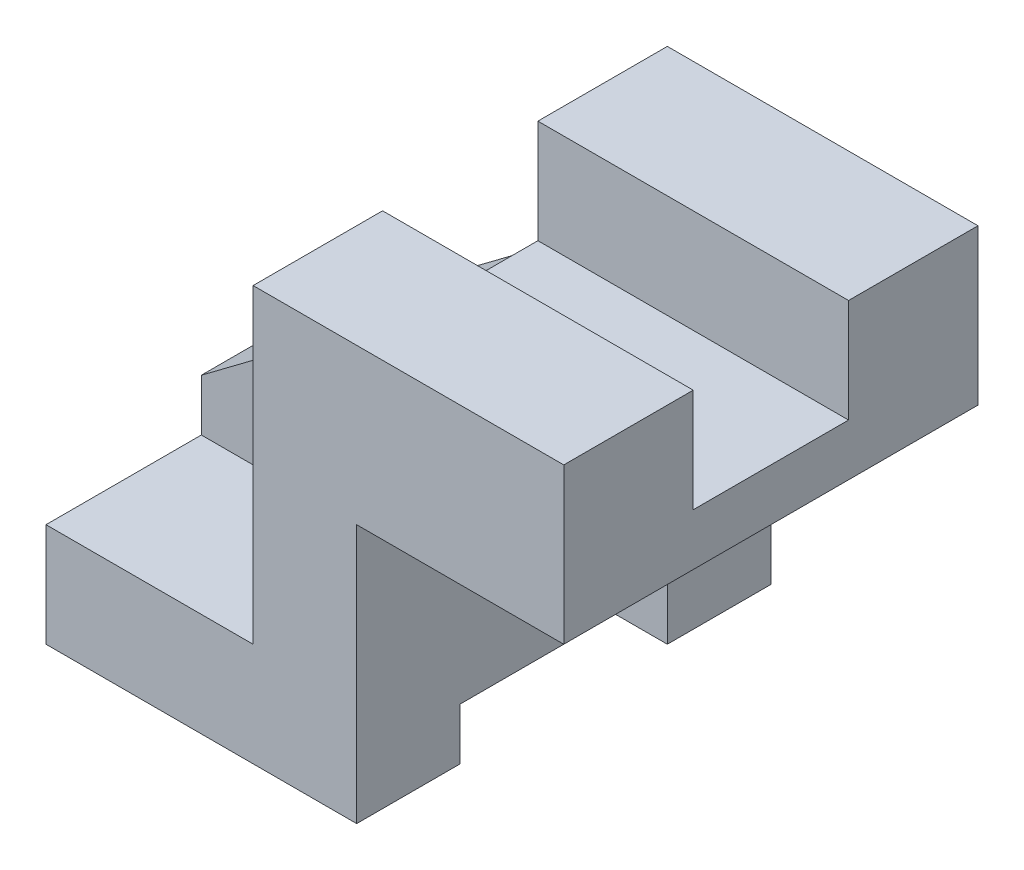
ISO-10303-21;
HEADER;
FILE_DESCRIPTION(('STEP AP214'),'2;1');
FILE_NAME('part.step','',(''),(''),'','','');
FILE_SCHEMA(('AUTOMOTIVE_DESIGN { 1 0 10303 214 1 1 1 1 }'));
ENDSEC;
DATA;
#1=APPLICATION_CONTEXT('core data for automotive mechanical design processes');
#2=APPLICATION_PROTOCOL_DEFINITION('international standard','automotive_design',2000,#1);
#3=PRODUCT_CONTEXT('',#1,'mechanical');
#4=PRODUCT('Part','Part','',(#3));
#5=PRODUCT_RELATED_PRODUCT_CATEGORY('part','',(#4));
#6=PRODUCT_DEFINITION_FORMATION('','',#4);
#7=PRODUCT_DEFINITION_CONTEXT('part definition',#1,'design');
#8=PRODUCT_DEFINITION('design','',#6,#7);
#9=PRODUCT_DEFINITION_SHAPE('','',#8);
#10=(LENGTH_UNIT() NAMED_UNIT(*) SI_UNIT(.MILLI.,.METRE.));
#11=(NAMED_UNIT(*) PLANE_ANGLE_UNIT() SI_UNIT($,.RADIAN.));
#12=(NAMED_UNIT(*) SI_UNIT($,.STERADIAN.) SOLID_ANGLE_UNIT());
#13=UNCERTAINTY_MEASURE_WITH_UNIT(LENGTH_MEASURE(1.E-05),#10,'distance_accuracy_value','');
#14=(GEOMETRIC_REPRESENTATION_CONTEXT(3) GLOBAL_UNCERTAINTY_ASSIGNED_CONTEXT((#13)) GLOBAL_UNIT_ASSIGNED_CONTEXT((#10,
#11,#12)) REPRESENTATION_CONTEXT('',''));
#15=CARTESIAN_POINT('',(0.,0.,0.));
#16=DIRECTION('',(0.,0.,1.));
#17=DIRECTION('',(1.,0.,0.));
#18=AXIS2_PLACEMENT_3D('',#15,#16,#17);
#19=CARTESIAN_POINT('',(0.,0.,40.));
#20=DIRECTION('',(1.,0.,0.));
#21=DIRECTION('',(0.,0.,-1.));
#22=AXIS2_PLACEMENT_3D('',#19,#20,#21);
#23=PLANE('',#22);
#24=DIRECTION('',(0.,-1.,0.));
#25=VECTOR('',#24,1.);
#26=CARTESIAN_POINT('',(0.,0.,20.));
#27=LINE('',#26,#25);
#28=CARTESIAN_POINT('',(0.,9.99999999999999,20.));
#29=VERTEX_POINT('',#28);
#30=CARTESIAN_POINT('',(0.,0.,20.));
#31=VERTEX_POINT('',#30);
#32=EDGE_CURVE('E174',#29,#31,#27,.T.);
#33=ORIENTED_EDGE('',*,*,#32,.T.);
#34=DIRECTION('',(0.,0.,-1.));
#35=VECTOR('',#34,1.);
#36=CARTESIAN_POINT('',(0.,0.,40.));
#37=LINE('',#36,#35);
#38=CARTESIAN_POINT('',(0.,0.,40.));
#39=VERTEX_POINT('',#38);
#40=EDGE_CURVE('E186',#39,#31,#37,.T.);
#41=ORIENTED_EDGE('',*,*,#40,.F.);
#42=DIRECTION('',(0.,-1.,0.));
#43=VECTOR('',#42,1.);
#44=CARTESIAN_POINT('',(0.,0.,40.));
#45=LINE('',#44,#43);
#46=CARTESIAN_POINT('',(0.,20.,40.));
#47=VERTEX_POINT('',#46);
#48=EDGE_CURVE('E274',#47,#39,#45,.T.);
#49=ORIENTED_EDGE('',*,*,#48,.F.);
#50=DIRECTION('',(0.,0.,-1.));
#51=VECTOR('',#50,1.);
#52=CARTESIAN_POINT('',(0.,20.,40.));
#53=LINE('',#52,#51);
#54=CARTESIAN_POINT('',(0.,20.,10.));
#55=VERTEX_POINT('',#54);
#56=EDGE_CURVE('E197',#47,#55,#53,.T.);
#57=ORIENTED_EDGE('',*,*,#56,.T.);
#58=DIRECTION('',(0.,1.,0.));
#59=VECTOR('',#58,1.);
#60=CARTESIAN_POINT('',(0.,0.,10.));
#61=LINE('',#60,#59);
#62=CARTESIAN_POINT('',(0.,30.,10.));
#63=VERTEX_POINT('',#62);
#64=EDGE_CURVE('E246',#55,#63,#61,.T.);
#65=ORIENTED_EDGE('',*,*,#64,.T.);
#66=DIRECTION('',(0.,0.,-1.));
#67=VECTOR('',#66,1.);
#68=CARTESIAN_POINT('',(0.,30.,10.));
#69=LINE('',#68,#67);
#70=CARTESIAN_POINT('',(0.,30.,-10.));
#71=VERTEX_POINT('',#70);
#72=EDGE_CURVE('E268',#63,#71,#69,.T.);
#73=ORIENTED_EDGE('',*,*,#72,.T.);
#74=DIRECTION('',(0.,1.,0.));
#75=VECTOR('',#74,1.);
#76=CARTESIAN_POINT('',(0.,0.,-10.));
#77=LINE('',#76,#75);
#78=CARTESIAN_POINT('',(0.,20.,-10.));
#79=VERTEX_POINT('',#78);
#80=EDGE_CURVE('E258',#79,#71,#77,.T.);
#81=ORIENTED_EDGE('',*,*,#80,.F.);
#82=CARTESIAN_POINT('',(0.,20.,-40.));
#83=VERTEX_POINT('',#82);
#84=EDGE_CURVE('E56',#79,#83,#53,.T.);
#85=ORIENTED_EDGE('',*,*,#84,.T.);
#86=DIRECTION('',(0.,-1.,0.));
#87=VECTOR('',#86,1.);
#88=CARTESIAN_POINT('',(0.,0.,-40.));
#89=LINE('',#88,#87);
#90=CARTESIAN_POINT('',(0.,0.,-40.));
#91=VERTEX_POINT('',#90);
#92=EDGE_CURVE('E290',#83,#91,#89,.T.);
#93=ORIENTED_EDGE('',*,*,#92,.T.);
#94=CARTESIAN_POINT('',(0.,0.,-20.));
#95=VERTEX_POINT('',#94);
#96=EDGE_CURVE('E195',#95,#91,#37,.T.);
#97=ORIENTED_EDGE('',*,*,#96,.F.);
#98=DIRECTION('',(0.,1.,0.));
#99=VECTOR('',#98,1.);
#100=CARTESIAN_POINT('',(0.,10.,-20.));
#101=LINE('',#100,#99);
#102=CARTESIAN_POINT('',(0.,10.,-20.));
#103=VERTEX_POINT('',#102);
#104=EDGE_CURVE('E190',#95,#103,#101,.T.);
#105=ORIENTED_EDGE('',*,*,#104,.T.);
#106=DIRECTION('',(0.,0.,1.));
#107=VECTOR('',#106,1.);
#108=CARTESIAN_POINT('',(0.,9.99999999999999,20.));
#109=LINE('',#108,#107);
#110=EDGE_CURVE('E189',#103,#29,#109,.T.);
#111=ORIENTED_EDGE('',*,*,#110,.T.);
#112=EDGE_LOOP('',(#33,#41,#49,#57,#65,#73,#81,#85,#93,#97,#105,#111));
#113=FACE_BOUND('',#112,.T.);
#114=ADVANCED_FACE('F33',(#113),#23,.F.);
#115=CARTESIAN_POINT('',(0.,0.,40.));
#116=DIRECTION('',(0.,1.,0.));
#117=DIRECTION('',(0.,0.,1.));
#118=AXIS2_PLACEMENT_3D('',#115,#116,#117);
#119=PLANE('',#118);
#120=DIRECTION('',(-1.,0.,0.));
#121=VECTOR('',#120,1.);
#122=CARTESIAN_POINT('',(100.,0.,20.));
#123=LINE('',#122,#121);
#124=CARTESIAN_POINT('',(60.,0.,20.));
#125=VERTEX_POINT('',#124);
#126=EDGE_CURVE('E170',#125,#31,#123,.T.);
#127=ORIENTED_EDGE('',*,*,#126,.F.);
#128=DIRECTION('',(0.,0.,-1.));
#129=VECTOR('',#128,1.);
#130=CARTESIAN_POINT('',(60.,0.,40.));
#131=LINE('',#130,#129);
#132=CARTESIAN_POINT('',(60.,0.,40.));
#133=VERTEX_POINT('',#132);
#134=EDGE_CURVE('E199',#133,#125,#131,.T.);
#135=ORIENTED_EDGE('',*,*,#134,.F.);
#136=DIRECTION('',(1.,0.,0.));
#137=VECTOR('',#136,1.);
#138=CARTESIAN_POINT('',(0.,0.,40.));
#139=LINE('',#138,#137);
#140=EDGE_CURVE('E194',#39,#133,#139,.T.);
#141=ORIENTED_EDGE('',*,*,#140,.F.);
#142=ORIENTED_EDGE('',*,*,#40,.T.);
#143=EDGE_LOOP('',(#127,#135,#141,#142));
#144=FACE_BOUND('',#143,.T.);
#145=ADVANCED_FACE('F193',(#144),#119,.F.);
#146=DIRECTION('',(-1.,0.,0.));
#147=VECTOR('',#146,1.);
#148=CARTESIAN_POINT('',(100.,0.,-20.));
#149=LINE('',#148,#147);
#150=CARTESIAN_POINT('',(60.,0.,-20.));
#151=VERTEX_POINT('',#150);
#152=EDGE_CURVE('E182',#151,#95,#149,.T.);
#153=ORIENTED_EDGE('',*,*,#152,.T.);
#154=ORIENTED_EDGE('',*,*,#96,.T.);
#155=DIRECTION('',(1.,0.,0.));
#156=VECTOR('',#155,1.);
#157=CARTESIAN_POINT('',(0.,0.,-40.));
#158=LINE('',#157,#156);
#159=CARTESIAN_POINT('',(60.,0.,-40.));
#160=VERTEX_POINT('',#159);
#161=EDGE_CURVE('E293',#91,#160,#158,.T.);
#162=ORIENTED_EDGE('',*,*,#161,.T.);
#163=EDGE_CURVE('E323',#151,#160,#131,.T.);
#164=ORIENTED_EDGE('',*,*,#163,.F.);
#165=EDGE_LOOP('',(#153,#154,#162,#164));
#166=FACE_BOUND('',#165,.T.);
#167=ADVANCED_FACE('F363',(#166),#119,.F.);
#168=CARTESIAN_POINT('',(60.,0.,40.));
#169=DIRECTION('',(-1.,0.,0.));
#170=DIRECTION('',(0.,-1.,0.));
#171=AXIS2_PLACEMENT_3D('',#168,#169,#170);
#172=PLANE('',#171);
#173=DIRECTION('',(0.,-1.,0.));
#174=VECTOR('',#173,1.);
#175=CARTESIAN_POINT('',(60.,0.,20.));
#176=LINE('',#175,#174);
#177=CARTESIAN_POINT('',(60.,9.99999999999999,20.));
#178=VERTEX_POINT('',#177);
#179=EDGE_CURVE('E11',#178,#125,#176,.T.);
#180=ORIENTED_EDGE('',*,*,#179,.F.);
#181=DIRECTION('',(0.,0.,1.));
#182=VECTOR('',#181,1.);
#183=CARTESIAN_POINT('',(60.,9.99999999999999,40.));
#184=LINE('',#183,#182);
#185=CARTESIAN_POINT('',(60.,10.,-20.));
#186=VERTEX_POINT('',#185);
#187=EDGE_CURVE('E208',#186,#178,#184,.T.);
#188=ORIENTED_EDGE('',*,*,#187,.F.);
#189=DIRECTION('',(0.,1.,0.));
#190=VECTOR('',#189,1.);
#191=CARTESIAN_POINT('',(60.,0.,-20.));
#192=LINE('',#191,#190);
#193=EDGE_CURVE('E41',#151,#186,#192,.T.);
#194=ORIENTED_EDGE('',*,*,#193,.F.);
#195=ORIENTED_EDGE('',*,*,#163,.T.);
#196=DIRECTION('',(0.,1.,0.));
#197=VECTOR('',#196,1.);
#198=CARTESIAN_POINT('',(60.,0.,-40.));
#199=LINE('',#198,#197);
#200=CARTESIAN_POINT('',(60.,50.,-40.));
#201=VERTEX_POINT('',#200);
#202=EDGE_CURVE('E296',#160,#201,#199,.T.);
#203=ORIENTED_EDGE('',*,*,#202,.T.);
#204=DIRECTION('',(0.,0.,-1.));
#205=VECTOR('',#204,1.);
#206=CARTESIAN_POINT('',(60.,50.,40.));
#207=LINE('',#206,#205);
#208=CARTESIAN_POINT('',(60.,50.,40.));
#209=VERTEX_POINT('',#208);
#210=EDGE_CURVE('E321',#209,#201,#207,.T.);
#211=ORIENTED_EDGE('',*,*,#210,.F.);
#212=DIRECTION('',(0.,1.,0.));
#213=VECTOR('',#212,1.);
#214=CARTESIAN_POINT('',(60.,0.,40.));
#215=LINE('',#214,#213);
#216=EDGE_CURVE('E278',#133,#209,#215,.T.);
#217=ORIENTED_EDGE('',*,*,#216,.F.);
#218=ORIENTED_EDGE('',*,*,#134,.T.);
#219=EDGE_LOOP('',(#180,#188,#194,#195,#203,#211,#217,#218));
#220=FACE_BOUND('',#219,.T.);
#221=ADVANCED_FACE('F216',(#220),#172,.F.);
#222=CARTESIAN_POINT('',(100.,0.,40.));
#223=DIRECTION('',(-1.,0.,0.));
#224=DIRECTION('',(0.,-1.,0.));
#225=AXIS2_PLACEMENT_3D('',#222,#223,#224);
#226=PLANE('',#225);
#227=DIRECTION('',(0.,-1.,0.));
#228=VECTOR('',#227,1.);
#229=CARTESIAN_POINT('',(100.,60.,15.));
#230=LINE('',#229,#228);
#231=CARTESIAN_POINT('',(100.,80.,15.));
#232=VERTEX_POINT('',#231);
#233=CARTESIAN_POINT('',(100.,60.,15.));
#234=VERTEX_POINT('',#233);
#235=EDGE_CURVE('E225',#232,#234,#230,.T.);
#236=ORIENTED_EDGE('',*,*,#235,.F.);
#237=DIRECTION('',(0.,0.,-1.));
#238=VECTOR('',#237,1.);
#239=CARTESIAN_POINT('',(100.,80.,40.));
#240=LINE('',#239,#238);
#241=CARTESIAN_POINT('',(100.,80.,40.));
#242=VERTEX_POINT('',#241);
#243=EDGE_CURVE('E316',#242,#232,#240,.T.);
#244=ORIENTED_EDGE('',*,*,#243,.F.);
#245=DIRECTION('',(0.,1.,0.));
#246=VECTOR('',#245,1.);
#247=CARTESIAN_POINT('',(100.,0.,40.));
#248=LINE('',#247,#246);
#249=CARTESIAN_POINT('',(100.,50.,40.));
#250=VERTEX_POINT('',#249);
#251=EDGE_CURVE('E282',#250,#242,#248,.T.);
#252=ORIENTED_EDGE('',*,*,#251,.F.);
#253=DIRECTION('',(0.,0.,-1.));
#254=VECTOR('',#253,1.);
#255=CARTESIAN_POINT('',(100.,50.,40.));
#256=LINE('',#255,#254);
#257=CARTESIAN_POINT('',(100.,50.,-40.));
#258=VERTEX_POINT('',#257);
#259=EDGE_CURVE('E319',#250,#258,#256,.T.);
#260=ORIENTED_EDGE('',*,*,#259,.T.);
#261=DIRECTION('',(0.,1.,0.));
#262=VECTOR('',#261,1.);
#263=CARTESIAN_POINT('',(100.,0.,-40.));
#264=LINE('',#263,#262);
#265=CARTESIAN_POINT('',(100.,80.,-40.));
#266=VERTEX_POINT('',#265);
#267=EDGE_CURVE('E300',#258,#266,#264,.T.);
#268=ORIENTED_EDGE('',*,*,#267,.T.);
#269=CARTESIAN_POINT('',(100.,80.,-15.));
#270=VERTEX_POINT('',#269);
#271=EDGE_CURVE('E315',#270,#266,#240,.T.);
#272=ORIENTED_EDGE('',*,*,#271,.F.);
#273=DIRECTION('',(0.,1.,0.));
#274=VECTOR('',#273,1.);
#275=CARTESIAN_POINT('',(100.,80.,-15.));
#276=LINE('',#275,#274);
#277=CARTESIAN_POINT('',(100.,60.,-15.));
#278=VERTEX_POINT('',#277);
#279=EDGE_CURVE('E229',#278,#270,#276,.T.);
#280=ORIENTED_EDGE('',*,*,#279,.F.);
#281=DIRECTION('',(0.,0.,-1.));
#282=VECTOR('',#281,1.);
#283=CARTESIAN_POINT('',(100.,60.,-15.));
#284=LINE('',#283,#282);
#285=EDGE_CURVE('E227',#234,#278,#284,.T.);
#286=ORIENTED_EDGE('',*,*,#285,.F.);
#287=EDGE_LOOP('',(#236,#244,#252,#260,#268,#272,#280,#286));
#288=FACE_BOUND('',#287,.T.);
#289=ADVANCED_FACE('F369',(#288),#226,.F.);
#290=CARTESIAN_POINT('',(0.,80.,40.));
#291=DIRECTION('',(0.,-1.,0.));
#292=DIRECTION('',(0.,0.,-1.));
#293=AXIS2_PLACEMENT_3D('',#290,#291,#292);
#294=PLANE('',#293);
#295=DIRECTION('',(-1.,0.,0.));
#296=VECTOR('',#295,1.);
#297=CARTESIAN_POINT('',(100.,80.,15.));
#298=LINE('',#297,#296);
#299=CARTESIAN_POINT('',(40.,80.,15.));
#300=VERTEX_POINT('',#299);
#301=EDGE_CURVE('E231',#232,#300,#298,.T.);
#302=ORIENTED_EDGE('',*,*,#301,.T.);
#303=DIRECTION('',(0.,0.,-1.));
#304=VECTOR('',#303,1.);
#305=CARTESIAN_POINT('',(40.,80.,40.));
#306=LINE('',#305,#304);
#307=CARTESIAN_POINT('',(40.,80.,40.));
#308=VERTEX_POINT('',#307);
#309=EDGE_CURVE('E312',#308,#300,#306,.T.);
#310=ORIENTED_EDGE('',*,*,#309,.F.);
#311=DIRECTION('',(-1.,0.,0.));
#312=VECTOR('',#311,1.);
#313=CARTESIAN_POINT('',(0.,80.,40.));
#314=LINE('',#313,#312);
#315=EDGE_CURVE('E284',#242,#308,#314,.T.);
#316=ORIENTED_EDGE('',*,*,#315,.F.);
#317=ORIENTED_EDGE('',*,*,#243,.T.);
#318=EDGE_LOOP('',(#302,#310,#316,#317));
#319=FACE_BOUND('',#318,.T.);
#320=ADVANCED_FACE('F377',(#319),#294,.F.);
#321=DIRECTION('',(-1.,0.,0.));
#322=VECTOR('',#321,1.);
#323=CARTESIAN_POINT('',(100.,80.,-15.));
#324=LINE('',#323,#322);
#325=CARTESIAN_POINT('',(40.,80.,-15.));
#326=VERTEX_POINT('',#325);
#327=EDGE_CURVE('E234',#270,#326,#324,.T.);
#328=ORIENTED_EDGE('',*,*,#327,.F.);
#329=ORIENTED_EDGE('',*,*,#271,.T.);
#330=DIRECTION('',(-1.,0.,0.));
#331=VECTOR('',#330,1.);
#332=CARTESIAN_POINT('',(0.,80.,-40.));
#333=LINE('',#332,#331);
#334=CARTESIAN_POINT('',(40.,80.,-40.));
#335=VERTEX_POINT('',#334);
#336=EDGE_CURVE('E303',#266,#335,#333,.T.);
#337=ORIENTED_EDGE('',*,*,#336,.T.);
#338=EDGE_CURVE('E311',#326,#335,#306,.T.);
#339=ORIENTED_EDGE('',*,*,#338,.F.);
#340=EDGE_LOOP('',(#328,#329,#337,#339));
#341=FACE_BOUND('',#340,.T.);
#342=ADVANCED_FACE('F400',(#341),#294,.F.);
#343=CARTESIAN_POINT('',(40.,0.,40.));
#344=DIRECTION('',(1.,0.,0.));
#345=DIRECTION('',(0.,0.,-1.));
#346=AXIS2_PLACEMENT_3D('',#343,#344,#345);
#347=PLANE('',#346);
#348=DIRECTION('',(0.,1.,0.));
#349=VECTOR('',#348,1.);
#350=CARTESIAN_POINT('',(40.,0.,15.));
#351=LINE('',#350,#349);
#352=CARTESIAN_POINT('',(40.,60.,15.));
#353=VERTEX_POINT('',#352);
#354=EDGE_CURVE('E206',#353,#300,#351,.T.);
#355=ORIENTED_EDGE('',*,*,#354,.F.);
#356=DIRECTION('',(0.,0.,1.));
#357=VECTOR('',#356,1.);
#358=CARTESIAN_POINT('',(40.,60.,40.));
#359=LINE('',#358,#357);
#360=CARTESIAN_POINT('',(40.,60.,10.));
#361=VERTEX_POINT('',#360);
#362=EDGE_CURVE('E181',#361,#353,#359,.T.);
#363=ORIENTED_EDGE('',*,*,#362,.F.);
#364=DIRECTION('',(0.,-1.,0.));
#365=VECTOR('',#364,1.);
#366=CARTESIAN_POINT('',(40.,0.,10.));
#367=LINE('',#366,#365);
#368=CARTESIAN_POINT('',(40.,20.,10.));
#369=VERTEX_POINT('',#368);
#370=EDGE_CURVE('E252',#361,#369,#367,.T.);
#371=ORIENTED_EDGE('',*,*,#370,.T.);
#372=DIRECTION('',(0.,0.,-1.));
#373=VECTOR('',#372,1.);
#374=CARTESIAN_POINT('',(40.,20.,40.));
#375=LINE('',#374,#373);
#376=CARTESIAN_POINT('',(40.,20.,40.));
#377=VERTEX_POINT('',#376);
#378=EDGE_CURVE('E308',#377,#369,#375,.T.);
#379=ORIENTED_EDGE('',*,*,#378,.F.);
#380=DIRECTION('',(0.,-1.,0.));
#381=VECTOR('',#380,1.);
#382=CARTESIAN_POINT('',(40.,0.,40.));
#383=LINE('',#382,#381);
#384=EDGE_CURVE('E286',#308,#377,#383,.T.);
#385=ORIENTED_EDGE('',*,*,#384,.F.);
#386=ORIENTED_EDGE('',*,*,#309,.T.);
#387=EDGE_LOOP('',(#355,#363,#371,#379,#385,#386));
#388=FACE_BOUND('',#387,.T.);
#389=ADVANCED_FACE('F380',(#388),#347,.F.);
#390=CARTESIAN_POINT('',(40.,60.,-15.));
#391=VERTEX_POINT('',#390);
#392=CARTESIAN_POINT('',(40.,60.,-10.));
#393=VERTEX_POINT('',#392);
#394=EDGE_CURVE('E242',#391,#393,#359,.T.);
#395=ORIENTED_EDGE('',*,*,#394,.F.);
#396=DIRECTION('',(0.,-1.,0.));
#397=VECTOR('',#396,1.);
#398=CARTESIAN_POINT('',(40.,0.,-15.));
#399=LINE('',#398,#397);
#400=EDGE_CURVE('E204',#326,#391,#399,.T.);
#401=ORIENTED_EDGE('',*,*,#400,.F.);
#402=ORIENTED_EDGE('',*,*,#338,.T.);
#403=DIRECTION('',(0.,-1.,0.));
#404=VECTOR('',#403,1.);
#405=CARTESIAN_POINT('',(40.,0.,-40.));
#406=LINE('',#405,#404);
#407=CARTESIAN_POINT('',(40.,20.,-40.));
#408=VERTEX_POINT('',#407);
#409=EDGE_CURVE('E275',#335,#408,#406,.T.);
#410=ORIENTED_EDGE('',*,*,#409,.T.);
#411=CARTESIAN_POINT('',(40.,20.,-10.));
#412=VERTEX_POINT('',#411);
#413=EDGE_CURVE('E288',#412,#408,#375,.T.);
#414=ORIENTED_EDGE('',*,*,#413,.F.);
#415=DIRECTION('',(0.,-1.,0.));
#416=VECTOR('',#415,1.);
#417=CARTESIAN_POINT('',(40.,0.,-10.));
#418=LINE('',#417,#416);
#419=EDGE_CURVE('E247',#393,#412,#418,.T.);
#420=ORIENTED_EDGE('',*,*,#419,.F.);
#421=EDGE_LOOP('',(#395,#401,#402,#410,#414,#420));
#422=FACE_BOUND('',#421,.T.);
#423=ADVANCED_FACE('F353',(#422),#347,.F.);
#424=CARTESIAN_POINT('',(0.,20.,40.));
#425=DIRECTION('',(0.,-1.,0.));
#426=DIRECTION('',(1.,0.,0.));
#427=AXIS2_PLACEMENT_3D('',#424,#425,#426);
#428=PLANE('',#427);
#429=DIRECTION('',(-1.,0.,0.));
#430=VECTOR('',#429,1.);
#431=CARTESIAN_POINT('',(0.,20.,-10.));
#432=LINE('',#431,#430);
#433=EDGE_CURVE('E261',#412,#79,#432,.T.);
#434=ORIENTED_EDGE('',*,*,#433,.F.);
#435=ORIENTED_EDGE('',*,*,#413,.T.);
#436=DIRECTION('',(-1.,0.,0.));
#437=VECTOR('',#436,1.);
#438=CARTESIAN_POINT('',(0.,20.,-40.));
#439=LINE('',#438,#437);
#440=EDGE_CURVE('E270',#408,#83,#439,.T.);
#441=ORIENTED_EDGE('',*,*,#440,.T.);
#442=ORIENTED_EDGE('',*,*,#84,.F.);
#443=EDGE_LOOP('',(#434,#435,#441,#442));
#444=FACE_BOUND('',#443,.T.);
#445=ADVANCED_FACE('F348',(#444),#428,.F.);
#446=ORIENTED_EDGE('',*,*,#378,.T.);
#447=DIRECTION('',(-1.,0.,0.));
#448=VECTOR('',#447,1.);
#449=CARTESIAN_POINT('',(0.,20.,10.));
#450=LINE('',#449,#448);
#451=EDGE_CURVE('E250',#369,#55,#450,.T.);
#452=ORIENTED_EDGE('',*,*,#451,.T.);
#453=ORIENTED_EDGE('',*,*,#56,.F.);
#454=DIRECTION('',(-1.,0.,0.));
#455=VECTOR('',#454,1.);
#456=CARTESIAN_POINT('',(0.,20.,40.));
#457=LINE('',#456,#455);
#458=EDGE_CURVE('E271',#377,#47,#457,.T.);
#459=ORIENTED_EDGE('',*,*,#458,.F.);
#460=EDGE_LOOP('',(#446,#452,#453,#459));
#461=FACE_BOUND('',#460,.T.);
#462=ADVANCED_FACE('F35',(#461),#428,.F.);
#463=CARTESIAN_POINT('',(0.,50.,40.));
#464=DIRECTION('',(0.,1.,0.));
#465=DIRECTION('',(0.,0.,1.));
#466=AXIS2_PLACEMENT_3D('',#463,#464,#465);
#467=PLANE('',#466);
#468=DIRECTION('',(1.,0.,0.));
#469=VECTOR('',#468,1.);
#470=CARTESIAN_POINT('',(0.,50.,-40.));
#471=LINE('',#470,#469);
#472=EDGE_CURVE('E298',#201,#258,#471,.T.);
#473=ORIENTED_EDGE('',*,*,#472,.T.);
#474=ORIENTED_EDGE('',*,*,#259,.F.);
#475=DIRECTION('',(1.,0.,0.));
#476=VECTOR('',#475,1.);
#477=CARTESIAN_POINT('',(0.,50.,40.));
#478=LINE('',#477,#476);
#479=EDGE_CURVE('E280',#209,#250,#478,.T.);
#480=ORIENTED_EDGE('',*,*,#479,.F.);
#481=ORIENTED_EDGE('',*,*,#210,.T.);
#482=EDGE_LOOP('',(#473,#474,#480,#481));
#483=FACE_BOUND('',#482,.T.);
#484=ADVANCED_FACE('F365',(#483),#467,.F.);
#485=CARTESIAN_POINT('',(0.,0.,40.));
#486=DIRECTION('',(0.,0.,1.));
#487=DIRECTION('',(1.,0.,0.));
#488=AXIS2_PLACEMENT_3D('',#485,#486,#487);
#489=PLANE('',#488);
#490=ORIENTED_EDGE('',*,*,#458,.T.);
#491=ORIENTED_EDGE('',*,*,#48,.T.);
#492=ORIENTED_EDGE('',*,*,#140,.T.);
#493=ORIENTED_EDGE('',*,*,#216,.T.);
#494=ORIENTED_EDGE('',*,*,#479,.T.);
#495=ORIENTED_EDGE('',*,*,#251,.T.);
#496=ORIENTED_EDGE('',*,*,#315,.T.);
#497=ORIENTED_EDGE('',*,*,#384,.T.);
#498=EDGE_LOOP('',(#490,#491,#492,#493,#494,#495,#496,#497));
#499=FACE_BOUND('',#498,.T.);
#500=ADVANCED_FACE('F330',(#499),#489,.T.);
#501=CARTESIAN_POINT('',(0.,0.,-40.));
#502=DIRECTION('',(0.,0.,1.));
#503=DIRECTION('',(1.,0.,0.));
#504=AXIS2_PLACEMENT_3D('',#501,#502,#503);
#505=PLANE('',#504);
#506=ORIENTED_EDGE('',*,*,#440,.F.);
#507=ORIENTED_EDGE('',*,*,#409,.F.);
#508=ORIENTED_EDGE('',*,*,#336,.F.);
#509=ORIENTED_EDGE('',*,*,#267,.F.);
#510=ORIENTED_EDGE('',*,*,#472,.F.);
#511=ORIENTED_EDGE('',*,*,#202,.F.);
#512=ORIENTED_EDGE('',*,*,#161,.F.);
#513=ORIENTED_EDGE('',*,*,#92,.F.);
#514=EDGE_LOOP('',(#506,#507,#508,#509,#510,#511,#512,#513));
#515=FACE_BOUND('',#514,.T.);
#516=ADVANCED_FACE('F358',(#515),#505,.F.);
#517=CARTESIAN_POINT('',(-14.4,19.2,10.));
#518=DIRECTION('',(-0.6,0.8,0.));
#519=DIRECTION('',(-0.8,-0.6,0.));
#520=AXIS2_PLACEMENT_3D('',#517,#518,#519);
#521=PLANE('',#520);
#522=DIRECTION('',(0.8,0.6,0.));
#523=VECTOR('',#522,1.);
#524=CARTESIAN_POINT('',(-14.4,19.2,-10.));
#525=LINE('',#524,#523);
#526=EDGE_CURVE('E255',#71,#393,#525,.T.);
#527=ORIENTED_EDGE('',*,*,#526,.F.);
#528=ORIENTED_EDGE('',*,*,#72,.F.);
#529=DIRECTION('',(0.8,0.6,0.));
#530=VECTOR('',#529,1.);
#531=CARTESIAN_POINT('',(-14.4,19.2,10.));
#532=LINE('',#531,#530);
#533=EDGE_CURVE('E243',#63,#361,#532,.T.);
#534=ORIENTED_EDGE('',*,*,#533,.T.);
#535=DIRECTION('',(0.,0.,-1.));
#536=VECTOR('',#535,1.);
#537=CARTESIAN_POINT('',(40.,60.,10.));
#538=LINE('',#537,#536);
#539=EDGE_CURVE('E254',#361,#393,#538,.T.);
#540=ORIENTED_EDGE('',*,*,#539,.T.);
#541=EDGE_LOOP('',(#527,#528,#534,#540));
#542=FACE_BOUND('',#541,.T.);
#543=ADVANCED_FACE('F343',(#542),#521,.T.);
#544=CARTESIAN_POINT('',(0.,0.,10.));
#545=DIRECTION('',(0.,0.,1.));
#546=DIRECTION('',(1.,0.,0.));
#547=AXIS2_PLACEMENT_3D('',#544,#545,#546);
#548=PLANE('',#547);
#549=ORIENTED_EDGE('',*,*,#533,.F.);
#550=ORIENTED_EDGE('',*,*,#64,.F.);
#551=ORIENTED_EDGE('',*,*,#451,.F.);
#552=ORIENTED_EDGE('',*,*,#370,.F.);
#553=EDGE_LOOP('',(#549,#550,#551,#552));
#554=FACE_BOUND('',#553,.T.);
#555=ADVANCED_FACE('F339',(#554),#548,.T.);
#556=CARTESIAN_POINT('',(0.,0.,-10.));
#557=DIRECTION('',(0.,0.,1.));
#558=DIRECTION('',(1.,0.,0.));
#559=AXIS2_PLACEMENT_3D('',#556,#557,#558);
#560=PLANE('',#559);
#561=ORIENTED_EDGE('',*,*,#526,.T.);
#562=ORIENTED_EDGE('',*,*,#419,.T.);
#563=ORIENTED_EDGE('',*,*,#433,.T.);
#564=ORIENTED_EDGE('',*,*,#80,.T.);
#565=EDGE_LOOP('',(#561,#562,#563,#564));
#566=FACE_BOUND('',#565,.T.);
#567=ADVANCED_FACE('F346',(#566),#560,.F.);
#568=CARTESIAN_POINT('',(100.,60.,15.));
#569=DIRECTION('',(0.,0.,-1.));
#570=DIRECTION('',(-1.,0.,0.));
#571=AXIS2_PLACEMENT_3D('',#568,#569,#570);
#572=PLANE('',#571);
#573=ORIENTED_EDGE('',*,*,#354,.T.);
#574=ORIENTED_EDGE('',*,*,#301,.F.);
#575=ORIENTED_EDGE('',*,*,#235,.T.);
#576=DIRECTION('',(-1.,0.,0.));
#577=VECTOR('',#576,1.);
#578=CARTESIAN_POINT('',(100.,60.,15.));
#579=LINE('',#578,#577);
#580=EDGE_CURVE('E191',#234,#353,#579,.T.);
#581=ORIENTED_EDGE('',*,*,#580,.T.);
#582=EDGE_LOOP('',(#573,#574,#575,#581));
#583=FACE_BOUND('',#582,.T.);
#584=ADVANCED_FACE('F411',(#583),#572,.T.);
#585=CARTESIAN_POINT('',(100.,80.,-15.));
#586=DIRECTION('',(0.,0.,1.));
#587=DIRECTION('',(1.,0.,0.));
#588=AXIS2_PLACEMENT_3D('',#585,#586,#587);
#589=PLANE('',#588);
#590=ORIENTED_EDGE('',*,*,#400,.T.);
#591=DIRECTION('',(-1.,0.,0.));
#592=VECTOR('',#591,1.);
#593=CARTESIAN_POINT('',(100.,60.,-15.));
#594=LINE('',#593,#592);
#595=EDGE_CURVE('E236',#278,#391,#594,.T.);
#596=ORIENTED_EDGE('',*,*,#595,.F.);
#597=ORIENTED_EDGE('',*,*,#279,.T.);
#598=ORIENTED_EDGE('',*,*,#327,.T.);
#599=EDGE_LOOP('',(#590,#596,#597,#598));
#600=FACE_BOUND('',#599,.T.);
#601=ADVANCED_FACE('F416',(#600),#589,.T.);
#602=CARTESIAN_POINT('',(100.,60.,-15.));
#603=DIRECTION('',(0.,1.,0.));
#604=DIRECTION('',(0.,0.,1.));
#605=AXIS2_PLACEMENT_3D('',#602,#603,#604);
#606=PLANE('',#605);
#607=ORIENTED_EDGE('',*,*,#394,.T.);
#608=ORIENTED_EDGE('',*,*,#539,.F.);
#609=ORIENTED_EDGE('',*,*,#362,.T.);
#610=ORIENTED_EDGE('',*,*,#580,.F.);
#611=ORIENTED_EDGE('',*,*,#285,.T.);
#612=ORIENTED_EDGE('',*,*,#595,.T.);
#613=EDGE_LOOP('',(#607,#608,#609,#610,#611,#612));
#614=FACE_BOUND('',#613,.T.);
#615=ADVANCED_FACE('F418',(#614),#606,.T.);
#616=CARTESIAN_POINT('',(100.,0.,20.));
#617=DIRECTION('',(0.,0.,-1.));
#618=DIRECTION('',(-1.,0.,0.));
#619=AXIS2_PLACEMENT_3D('',#616,#617,#618);
#620=PLANE('',#619);
#621=ORIENTED_EDGE('',*,*,#179,.T.);
#622=ORIENTED_EDGE('',*,*,#126,.T.);
#623=ORIENTED_EDGE('',*,*,#32,.F.);
#624=DIRECTION('',(-1.,0.,0.));
#625=VECTOR('',#624,1.);
#626=CARTESIAN_POINT('',(100.,9.99999999999999,20.));
#627=LINE('',#626,#625);
#628=EDGE_CURVE('E218',#178,#29,#627,.T.);
#629=ORIENTED_EDGE('',*,*,#628,.F.);
#630=EDGE_LOOP('',(#621,#622,#623,#629));
#631=FACE_BOUND('',#630,.T.);
#632=ADVANCED_FACE('F172',(#631),#620,.T.);
#633=CARTESIAN_POINT('',(100.,10.,-20.));
#634=DIRECTION('',(0.,0.,1.));
#635=DIRECTION('',(0.,-1.,0.));
#636=AXIS2_PLACEMENT_3D('',#633,#634,#635);
#637=PLANE('',#636);
#638=ORIENTED_EDGE('',*,*,#193,.T.);
#639=DIRECTION('',(-1.,0.,0.));
#640=VECTOR('',#639,1.);
#641=CARTESIAN_POINT('',(100.,10.,-20.));
#642=LINE('',#641,#640);
#643=EDGE_CURVE('E48',#186,#103,#642,.T.);
#644=ORIENTED_EDGE('',*,*,#643,.T.);
#645=ORIENTED_EDGE('',*,*,#104,.F.);
#646=ORIENTED_EDGE('',*,*,#152,.F.);
#647=EDGE_LOOP('',(#638,#644,#645,#646));
#648=FACE_BOUND('',#647,.T.);
#649=ADVANCED_FACE('F212',(#648),#637,.T.);
#650=CARTESIAN_POINT('',(100.,9.99999999999999,20.));
#651=DIRECTION('',(0.,-1.,0.));
#652=DIRECTION('',(0.,0.,-1.));
#653=AXIS2_PLACEMENT_3D('',#650,#651,#652);
#654=PLANE('',#653);
#655=ORIENTED_EDGE('',*,*,#187,.T.);
#656=ORIENTED_EDGE('',*,*,#628,.T.);
#657=ORIENTED_EDGE('',*,*,#110,.F.);
#658=ORIENTED_EDGE('',*,*,#643,.F.);
#659=EDGE_LOOP('',(#655,#656,#657,#658));
#660=FACE_BOUND('',#659,.T.);
#661=ADVANCED_FACE('F217',(#660),#654,.T.);
#662=CLOSED_SHELL('',(#114,#145,#167,#221,#289,#320,#342,#389,#423,#445,#462,#484,#500,#516,
#543,#555,#567,#584,#601,#615,#632,#649,#661));
#663=MANIFOLD_SOLID_BREP('B2',#662);
#664=ADVANCED_BREP_SHAPE_REPRESENTATION('',(#18,#663),#14);
#665=SHAPE_DEFINITION_REPRESENTATION(#9,#664);
ENDSEC;
END-ISO-10303-21;
